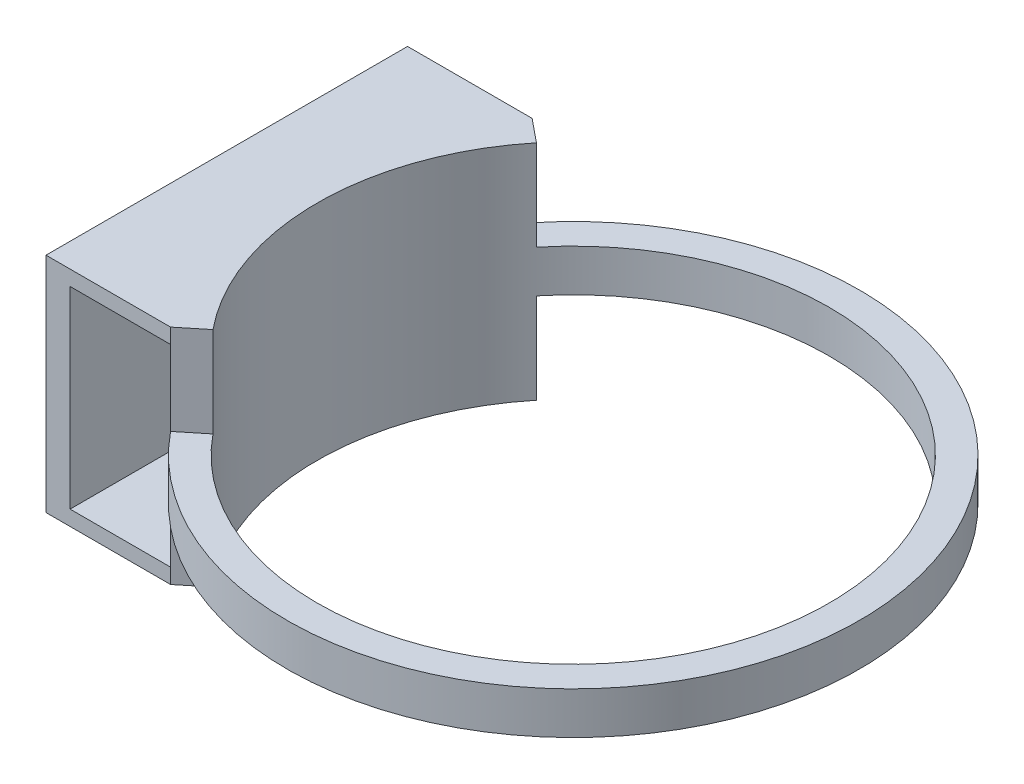
ISO-10303-21;
HEADER;
FILE_DESCRIPTION(('STEP AP214'),'2;1');
FILE_NAME('part.step','',(''),(''),'','','');
FILE_SCHEMA(('AUTOMOTIVE_DESIGN { 1 0 10303 214 1 1 1 1 }'));
ENDSEC;
DATA;
#1=APPLICATION_CONTEXT('core data for automotive mechanical design processes');
#2=APPLICATION_PROTOCOL_DEFINITION('international standard','automotive_design',2000,#1);
#3=PRODUCT_CONTEXT('',#1,'mechanical');
#4=PRODUCT('Part','Part','',(#3));
#5=PRODUCT_RELATED_PRODUCT_CATEGORY('part','',(#4));
#6=PRODUCT_DEFINITION_FORMATION('','',#4);
#7=PRODUCT_DEFINITION_CONTEXT('part definition',#1,'design');
#8=PRODUCT_DEFINITION('design','',#6,#7);
#9=PRODUCT_DEFINITION_SHAPE('','',#8);
#10=(LENGTH_UNIT() NAMED_UNIT(*) SI_UNIT(.MILLI.,.METRE.));
#11=(NAMED_UNIT(*) PLANE_ANGLE_UNIT() SI_UNIT($,.RADIAN.));
#12=(NAMED_UNIT(*) SI_UNIT($,.STERADIAN.) SOLID_ANGLE_UNIT());
#13=UNCERTAINTY_MEASURE_WITH_UNIT(LENGTH_MEASURE(1.E-05),#10,'distance_accuracy_value','');
#14=(GEOMETRIC_REPRESENTATION_CONTEXT(3) GLOBAL_UNCERTAINTY_ASSIGNED_CONTEXT((#13)) GLOBAL_UNIT_ASSIGNED_CONTEXT((#10,
#11,#12)) REPRESENTATION_CONTEXT('',''));
#15=CARTESIAN_POINT('',(0.,0.,0.));
#16=DIRECTION('',(0.,0.,1.));
#17=DIRECTION('',(1.,0.,0.));
#18=AXIS2_PLACEMENT_3D('',#15,#16,#17);
#19=CARTESIAN_POINT('',(0.,0.5,0.));
#20=DIRECTION('',(0.,1.,0.));
#21=DIRECTION('',(0.,0.,1.));
#22=AXIS2_PLACEMENT_3D('',#19,#20,#21);
#23=PLANE('',#22);
#24=DIRECTION('',(1.,0.,0.));
#25=VECTOR('',#24,1.);
#26=CARTESIAN_POINT('',(-11.5,0.5,6.));
#27=LINE('',#26,#25);
#28=CARTESIAN_POINT('',(-10.7,0.5,6.));
#29=VERTEX_POINT('',#28);
#30=CARTESIAN_POINT('',(-7.36545993132812,0.5,6.));
#31=VERTEX_POINT('',#30);
#32=EDGE_CURVE('E268',#29,#31,#27,.T.);
#33=ORIENTED_EDGE('',*,*,#32,.T.);
#34=CARTESIAN_POINT('',(0.,0.5,0.));
#35=DIRECTION('',(0.,1.,0.));
#36=DIRECTION('',(0.,0.,1.));
#37=AXIS2_PLACEMENT_3D('',#34,#35,#36);
#38=CIRCLE('',#37,9.5);
#39=CARTESIAN_POINT('',(-7.36545993132812,0.5,-6.));
#40=VERTEX_POINT('',#39);
#41=EDGE_CURVE('E163',#40,#31,#38,.T.);
#42=ORIENTED_EDGE('',*,*,#41,.F.);
#43=DIRECTION('',(-1.,0.,0.));
#44=VECTOR('',#43,1.);
#45=CARTESIAN_POINT('',(-11.5,0.5,-6.));
#46=LINE('',#45,#44);
#47=CARTESIAN_POINT('',(-10.7,0.5,-6.));
#48=VERTEX_POINT('',#47);
#49=EDGE_CURVE('E265',#40,#48,#46,.T.);
#50=ORIENTED_EDGE('',*,*,#49,.T.);
#51=DIRECTION('',(0.,0.,-1.));
#52=VECTOR('',#51,1.);
#53=CARTESIAN_POINT('',(-10.7,0.5,-6.));
#54=LINE('',#53,#52);
#55=EDGE_CURVE('E63',#29,#48,#54,.T.);
#56=ORIENTED_EDGE('',*,*,#55,.F.);
#57=EDGE_LOOP('',(#33,#42,#50,#56));
#58=FACE_BOUND('',#57,.T.);
#59=ADVANCED_FACE('F39',(#58),#23,.T.);
#60=CARTESIAN_POINT('',(0.,0.,0.));
#61=DIRECTION('',(0.,1.,0.));
#62=DIRECTION('',(0.,0.,1.));
#63=AXIS2_PLACEMENT_3D('',#60,#61,#62);
#64=PLANE('',#63);
#65=DIRECTION('',(-1.,0.,0.));
#66=VECTOR('',#65,1.);
#67=CARTESIAN_POINT('',(-11.5,0.,-6.));
#68=LINE('',#67,#66);
#69=CARTESIAN_POINT('',(-7.36545993132812,0.,-6.));
#70=VERTEX_POINT('',#69);
#71=CARTESIAN_POINT('',(-11.5,0.,-6.));
#72=VERTEX_POINT('',#71);
#73=EDGE_CURVE('E264',#70,#72,#68,.T.);
#74=ORIENTED_EDGE('',*,*,#73,.F.);
#75=DIRECTION('',(-0.775311571718749,0.,-0.631578947368421));
#76=VECTOR('',#75,1.);
#77=CARTESIAN_POINT('',(-7.36545993132812,0.,-6.));
#78=LINE('',#77,#76);
#79=CARTESIAN_POINT('',(-6.59014835960937,0.,-5.36842105263158));
#80=VERTEX_POINT('',#79);
#81=EDGE_CURVE('E158',#80,#70,#78,.T.);
#82=ORIENTED_EDGE('',*,*,#81,.F.);
#83=CARTESIAN_POINT('',(0.,0.,0.));
#84=DIRECTION('',(0.,1.,0.));
#85=DIRECTION('',(0.,0.,1.));
#86=AXIS2_PLACEMENT_3D('',#83,#84,#85);
#87=CIRCLE('',#86,8.5);
#88=CARTESIAN_POINT('',(-6.59014835960937,0.,5.36842105263158));
#89=VERTEX_POINT('',#88);
#90=EDGE_CURVE('E260',#80,#89,#87,.T.);
#91=ORIENTED_EDGE('',*,*,#90,.T.);
#92=DIRECTION('',(0.775311571718749,0.,-0.631578947368422));
#93=VECTOR('',#92,1.);
#94=CARTESIAN_POINT('',(-7.36545993132812,0.,6.));
#95=LINE('',#94,#93);
#96=CARTESIAN_POINT('',(-7.36545993132812,0.,6.));
#97=VERTEX_POINT('',#96);
#98=EDGE_CURVE('E300',#97,#89,#95,.T.);
#99=ORIENTED_EDGE('',*,*,#98,.F.);
#100=DIRECTION('',(1.,0.,0.));
#101=VECTOR('',#100,1.);
#102=CARTESIAN_POINT('',(-11.5,0.,6.));
#103=LINE('',#102,#101);
#104=CARTESIAN_POINT('',(-11.5,0.,6.));
#105=VERTEX_POINT('',#104);
#106=EDGE_CURVE('E269',#105,#97,#103,.T.);
#107=ORIENTED_EDGE('',*,*,#106,.F.);
#108=DIRECTION('',(0.,0.,1.));
#109=VECTOR('',#108,1.);
#110=CARTESIAN_POINT('',(-11.5,0.,-6.));
#111=LINE('',#110,#109);
#112=EDGE_CURVE('E275',#72,#105,#111,.T.);
#113=ORIENTED_EDGE('',*,*,#112,.F.);
#114=EDGE_LOOP('',(#74,#82,#91,#99,#107,#113));
#115=FACE_BOUND('',#114,.T.);
#116=ADVANCED_FACE('F297',(#115),#64,.F.);
#117=CARTESIAN_POINT('',(0.,0.5,0.));
#118=DIRECTION('',(0.,-1.,0.));
#119=DIRECTION('',(0.,0.,-1.));
#120=AXIS2_PLACEMENT_3D('',#117,#118,#119);
#121=CYLINDRICAL_SURFACE('',#120,9.5);
#122=CARTESIAN_POINT('',(0.,3.,0.));
#123=DIRECTION('',(0.,-1.,0.));
#124=DIRECTION('',(0.,0.,-1.));
#125=AXIS2_PLACEMENT_3D('',#122,#123,#124);
#126=CIRCLE('',#125,9.5);
#127=CARTESIAN_POINT('',(-7.36545993132812,3.,-6.));
#128=VERTEX_POINT('',#127);
#129=CARTESIAN_POINT('',(-7.36545993132812,3.,6.));
#130=VERTEX_POINT('',#129);
#131=EDGE_CURVE('E148',#128,#130,#126,.T.);
#132=ORIENTED_EDGE('',*,*,#131,.F.);
#133=DIRECTION('',(0.,-1.,0.));
#134=VECTOR('',#133,1.);
#135=CARTESIAN_POINT('',(-7.36545993132812,3.,-6.));
#136=LINE('',#135,#134);
#137=EDGE_CURVE('E193',#128,#40,#136,.T.);
#138=ORIENTED_EDGE('',*,*,#137,.T.);
#139=ORIENTED_EDGE('',*,*,#41,.T.);
#140=DIRECTION('',(0.,-1.,0.));
#141=VECTOR('',#140,1.);
#142=CARTESIAN_POINT('',(-7.36545993132812,3.,6.));
#143=LINE('',#142,#141);
#144=EDGE_CURVE('E142',#130,#31,#143,.T.);
#145=ORIENTED_EDGE('',*,*,#144,.F.);
#146=EDGE_LOOP('',(#132,#138,#139,#145));
#147=FACE_BOUND('',#146,.T.);
#148=CARTESIAN_POINT('',(0.,4.4,0.));
#149=DIRECTION('',(0.,1.,0.));
#150=DIRECTION('',(0.,0.,1.));
#151=AXIS2_PLACEMENT_3D('',#148,#149,#150);
#152=CIRCLE('',#151,9.5);
#153=CARTESIAN_POINT('',(-7.36545993132812,4.4,6.));
#154=VERTEX_POINT('',#153);
#155=CARTESIAN_POINT('',(-7.36545993132812,4.4,-6.));
#156=VERTEX_POINT('',#155);
#157=EDGE_CURVE('E173',#154,#156,#152,.T.);
#158=ORIENTED_EDGE('',*,*,#157,.F.);
#159=DIRECTION('',(0.,1.,0.));
#160=VECTOR('',#159,1.);
#161=CARTESIAN_POINT('',(-7.36545993132812,4.4,6.));
#162=LINE('',#161,#160);
#163=CARTESIAN_POINT('',(-7.36545993132812,6.9,6.));
#164=VERTEX_POINT('',#163);
#165=EDGE_CURVE('E196',#154,#164,#162,.T.);
#166=ORIENTED_EDGE('',*,*,#165,.T.);
#167=CARTESIAN_POINT('',(0.,6.9,0.));
#168=DIRECTION('',(0.,1.,0.));
#169=DIRECTION('',(0.,0.,1.));
#170=AXIS2_PLACEMENT_3D('',#167,#168,#169);
#171=CIRCLE('',#170,9.5);
#172=CARTESIAN_POINT('',(-7.36545993132812,6.9,-6.));
#173=VERTEX_POINT('',#172);
#174=EDGE_CURVE('E240',#173,#164,#171,.T.);
#175=ORIENTED_EDGE('',*,*,#174,.F.);
#176=DIRECTION('',(0.,1.,0.));
#177=VECTOR('',#176,1.);
#178=CARTESIAN_POINT('',(-7.36545993132812,4.4,-6.));
#179=LINE('',#178,#177);
#180=EDGE_CURVE('E189',#156,#173,#179,.T.);
#181=ORIENTED_EDGE('',*,*,#180,.F.);
#182=EDGE_LOOP('',(#158,#166,#175,#181));
#183=FACE_BOUND('',#182,.T.);
#184=ADVANCED_FACE('F41',(#147,#183),#121,.T.);
#185=CARTESIAN_POINT('',(-11.5,0.5,-6.));
#186=DIRECTION('',(0.,0.,1.));
#187=DIRECTION('',(1.,0.,0.));
#188=AXIS2_PLACEMENT_3D('',#185,#186,#187);
#189=PLANE('',#188);
#190=ORIENTED_EDGE('',*,*,#73,.T.);
#191=DIRECTION('',(0.,-1.,0.));
#192=VECTOR('',#191,1.);
#193=CARTESIAN_POINT('',(-11.5,0.5,-6.));
#194=LINE('',#193,#192);
#195=CARTESIAN_POINT('',(-11.5,7.4,-6.));
#196=VERTEX_POINT('',#195);
#197=EDGE_CURVE('E48',#196,#72,#194,.T.);
#198=ORIENTED_EDGE('',*,*,#197,.F.);
#199=DIRECTION('',(-1.,0.,0.));
#200=VECTOR('',#199,1.);
#201=CARTESIAN_POINT('',(-11.5,7.4,-6.));
#202=LINE('',#201,#200);
#203=CARTESIAN_POINT('',(-7.36545993132812,7.4,-6.));
#204=VERTEX_POINT('',#203);
#205=EDGE_CURVE('E214',#204,#196,#202,.T.);
#206=ORIENTED_EDGE('',*,*,#205,.F.);
#207=DIRECTION('',(0.,-1.,0.));
#208=VECTOR('',#207,1.);
#209=CARTESIAN_POINT('',(-7.36545993132812,7.4,-6.));
#210=LINE('',#209,#208);
#211=EDGE_CURVE('E227',#204,#173,#210,.T.);
#212=ORIENTED_EDGE('',*,*,#211,.T.);
#213=DIRECTION('',(-1.,0.,0.));
#214=VECTOR('',#213,1.);
#215=CARTESIAN_POINT('',(-11.5,6.9,-6.));
#216=LINE('',#215,#214);
#217=CARTESIAN_POINT('',(-10.7,6.9,-6.));
#218=VERTEX_POINT('',#217);
#219=EDGE_CURVE('E213',#173,#218,#216,.T.);
#220=ORIENTED_EDGE('',*,*,#219,.T.);
#221=DIRECTION('',(0.,-1.,0.));
#222=VECTOR('',#221,1.);
#223=CARTESIAN_POINT('',(-10.7,6.9,-6.));
#224=LINE('',#223,#222);
#225=EDGE_CURVE('E250',#218,#48,#224,.T.);
#226=ORIENTED_EDGE('',*,*,#225,.T.);
#227=ORIENTED_EDGE('',*,*,#49,.F.);
#228=DIRECTION('',(0.,-1.,0.));
#229=VECTOR('',#228,1.);
#230=CARTESIAN_POINT('',(-7.36545993132812,0.5,-6.));
#231=LINE('',#230,#229);
#232=EDGE_CURVE('E11',#40,#70,#231,.T.);
#233=ORIENTED_EDGE('',*,*,#232,.T.);
#234=EDGE_LOOP('',(#190,#198,#206,#212,#220,#226,#227,#233));
#235=FACE_BOUND('',#234,.T.);
#236=ADVANCED_FACE('F311',(#235),#189,.F.);
#237=CARTESIAN_POINT('',(-11.5,0.5,-6.));
#238=DIRECTION('',(1.,0.,0.));
#239=DIRECTION('',(0.,0.,-1.));
#240=AXIS2_PLACEMENT_3D('',#237,#238,#239);
#241=PLANE('',#240);
#242=ORIENTED_EDGE('',*,*,#112,.T.);
#243=DIRECTION('',(0.,-1.,0.));
#244=VECTOR('',#243,1.);
#245=CARTESIAN_POINT('',(-11.5,0.5,6.));
#246=LINE('',#245,#244);
#247=CARTESIAN_POINT('',(-11.5,7.4,6.));
#248=VERTEX_POINT('',#247);
#249=EDGE_CURVE('E283',#248,#105,#246,.T.);
#250=ORIENTED_EDGE('',*,*,#249,.F.);
#251=DIRECTION('',(0.,0.,1.));
#252=VECTOR('',#251,1.);
#253=CARTESIAN_POINT('',(-11.5,7.4,-6.));
#254=LINE('',#253,#252);
#255=EDGE_CURVE('E218',#196,#248,#254,.T.);
#256=ORIENTED_EDGE('',*,*,#255,.F.);
#257=ORIENTED_EDGE('',*,*,#197,.T.);
#258=EDGE_LOOP('',(#242,#250,#256,#257));
#259=FACE_BOUND('',#258,.T.);
#260=ADVANCED_FACE('F291',(#259),#241,.F.);
#261=CARTESIAN_POINT('',(-11.5,0.5,6.));
#262=DIRECTION('',(0.,0.,-1.));
#263=DIRECTION('',(-1.,0.,0.));
#264=AXIS2_PLACEMENT_3D('',#261,#262,#263);
#265=PLANE('',#264);
#266=ORIENTED_EDGE('',*,*,#106,.T.);
#267=DIRECTION('',(0.,-1.,0.));
#268=VECTOR('',#267,1.);
#269=CARTESIAN_POINT('',(-7.36545993132812,0.5,6.));
#270=LINE('',#269,#268);
#271=EDGE_CURVE('E272',#31,#97,#270,.T.);
#272=ORIENTED_EDGE('',*,*,#271,.F.);
#273=ORIENTED_EDGE('',*,*,#32,.F.);
#274=DIRECTION('',(0.,-1.,0.));
#275=VECTOR('',#274,1.);
#276=CARTESIAN_POINT('',(-10.7,6.9,6.));
#277=LINE('',#276,#275);
#278=CARTESIAN_POINT('',(-10.7,6.9,6.));
#279=VERTEX_POINT('',#278);
#280=EDGE_CURVE('E256',#279,#29,#277,.T.);
#281=ORIENTED_EDGE('',*,*,#280,.F.);
#282=DIRECTION('',(1.,0.,0.));
#283=VECTOR('',#282,1.);
#284=CARTESIAN_POINT('',(-11.5,6.9,6.));
#285=LINE('',#284,#283);
#286=EDGE_CURVE('E219',#279,#164,#285,.T.);
#287=ORIENTED_EDGE('',*,*,#286,.T.);
#288=DIRECTION('',(0.,-1.,0.));
#289=VECTOR('',#288,1.);
#290=CARTESIAN_POINT('',(-7.36545993132812,7.4,6.));
#291=LINE('',#290,#289);
#292=CARTESIAN_POINT('',(-7.36545993132812,7.4,6.));
#293=VERTEX_POINT('',#292);
#294=EDGE_CURVE('E237',#293,#164,#291,.T.);
#295=ORIENTED_EDGE('',*,*,#294,.F.);
#296=DIRECTION('',(1.,0.,0.));
#297=VECTOR('',#296,1.);
#298=CARTESIAN_POINT('',(-11.5,7.4,6.));
#299=LINE('',#298,#297);
#300=EDGE_CURVE('E223',#248,#293,#299,.T.);
#301=ORIENTED_EDGE('',*,*,#300,.F.);
#302=ORIENTED_EDGE('',*,*,#249,.T.);
#303=EDGE_LOOP('',(#266,#272,#273,#281,#287,#295,#301,#302));
#304=FACE_BOUND('',#303,.T.);
#305=ADVANCED_FACE('F303',(#304),#265,.F.);
#306=CARTESIAN_POINT('',(0.,0.5,0.));
#307=DIRECTION('',(0.,-1.,0.));
#308=DIRECTION('',(0.,0.,-1.));
#309=AXIS2_PLACEMENT_3D('',#306,#307,#308);
#310=CYLINDRICAL_SURFACE('',#309,8.5);
#311=DIRECTION('',(0.,-1.,0.));
#312=VECTOR('',#311,1.);
#313=CARTESIAN_POINT('',(-6.59014835960937,3.,-5.36842105263158));
#314=LINE('',#313,#312);
#315=CARTESIAN_POINT('',(-6.59014835960937,3.,-5.36842105263158));
#316=VERTEX_POINT('',#315);
#317=EDGE_CURVE('E168',#316,#80,#314,.T.);
#318=ORIENTED_EDGE('',*,*,#317,.F.);
#319=CARTESIAN_POINT('',(0.,3.,0.));
#320=DIRECTION('',(0.,1.,0.));
#321=DIRECTION('',(0.,0.,-1.));
#322=AXIS2_PLACEMENT_3D('',#319,#320,#321);
#323=CIRCLE('',#322,8.5);
#324=CARTESIAN_POINT('',(-6.59014835960937,3.,5.36842105263158));
#325=VERTEX_POINT('',#324);
#326=EDGE_CURVE('E147',#325,#316,#323,.T.);
#327=ORIENTED_EDGE('',*,*,#326,.F.);
#328=DIRECTION('',(0.,-1.,0.));
#329=VECTOR('',#328,1.);
#330=CARTESIAN_POINT('',(-6.59014835960937,3.,5.36842105263158));
#331=LINE('',#330,#329);
#332=EDGE_CURVE('E144',#325,#89,#331,.T.);
#333=ORIENTED_EDGE('',*,*,#332,.T.);
#334=ORIENTED_EDGE('',*,*,#90,.F.);
#335=EDGE_LOOP('',(#318,#327,#333,#334));
#336=FACE_BOUND('',#335,.T.);
#337=DIRECTION('',(0.,1.,0.));
#338=VECTOR('',#337,1.);
#339=CARTESIAN_POINT('',(-6.59014835960937,4.4,5.36842105263158));
#340=LINE('',#339,#338);
#341=CARTESIAN_POINT('',(-6.59014835960937,4.4,5.36842105263158));
#342=VERTEX_POINT('',#341);
#343=CARTESIAN_POINT('',(-6.59014835960937,7.4,5.36842105263158));
#344=VERTEX_POINT('',#343);
#345=EDGE_CURVE('E201',#342,#344,#340,.T.);
#346=ORIENTED_EDGE('',*,*,#345,.F.);
#347=CARTESIAN_POINT('',(0.,4.4,0.));
#348=DIRECTION('',(0.,-1.,0.));
#349=DIRECTION('',(0.,0.,1.));
#350=AXIS2_PLACEMENT_3D('',#347,#348,#349);
#351=CIRCLE('',#350,8.5);
#352=CARTESIAN_POINT('',(-6.59014835960937,4.4,-5.36842105263158));
#353=VERTEX_POINT('',#352);
#354=EDGE_CURVE('E182',#353,#342,#351,.T.);
#355=ORIENTED_EDGE('',*,*,#354,.F.);
#356=DIRECTION('',(0.,1.,0.));
#357=VECTOR('',#356,1.);
#358=CARTESIAN_POINT('',(-6.59014835960937,4.4,-5.36842105263158));
#359=LINE('',#358,#357);
#360=CARTESIAN_POINT('',(-6.59014835960937,7.4,-5.36842105263158));
#361=VERTEX_POINT('',#360);
#362=EDGE_CURVE('E204',#353,#361,#359,.T.);
#363=ORIENTED_EDGE('',*,*,#362,.T.);
#364=CARTESIAN_POINT('',(0.,7.4,0.));
#365=DIRECTION('',(0.,1.,0.));
#366=DIRECTION('',(0.,0.,1.));
#367=AXIS2_PLACEMENT_3D('',#364,#365,#366);
#368=CIRCLE('',#367,8.5);
#369=EDGE_CURVE('E200',#361,#344,#368,.T.);
#370=ORIENTED_EDGE('',*,*,#369,.T.);
#371=EDGE_LOOP('',(#346,#355,#363,#370));
#372=FACE_BOUND('',#371,.T.);
#373=ADVANCED_FACE('F332',(#336,#372),#310,.F.);
#374=CARTESIAN_POINT('',(-10.7,6.9,-6.));
#375=DIRECTION('',(-1.,0.,0.));
#376=DIRECTION('',(0.,0.,1.));
#377=AXIS2_PLACEMENT_3D('',#374,#375,#376);
#378=PLANE('',#377);
#379=ORIENTED_EDGE('',*,*,#55,.T.);
#380=ORIENTED_EDGE('',*,*,#225,.F.);
#381=DIRECTION('',(0.,0.,-1.));
#382=VECTOR('',#381,1.);
#383=CARTESIAN_POINT('',(-10.7,6.9,-6.));
#384=LINE('',#383,#382);
#385=EDGE_CURVE('E246',#279,#218,#384,.T.);
#386=ORIENTED_EDGE('',*,*,#385,.F.);
#387=ORIENTED_EDGE('',*,*,#280,.T.);
#388=EDGE_LOOP('',(#379,#380,#386,#387));
#389=FACE_BOUND('',#388,.T.);
#390=ADVANCED_FACE('F320',(#389),#378,.F.);
#391=CARTESIAN_POINT('',(0.,6.9,0.));
#392=DIRECTION('',(0.,1.,0.));
#393=DIRECTION('',(0.,0.,1.));
#394=AXIS2_PLACEMENT_3D('',#391,#392,#393);
#395=PLANE('',#394);
#396=ORIENTED_EDGE('',*,*,#286,.F.);
#397=ORIENTED_EDGE('',*,*,#385,.T.);
#398=ORIENTED_EDGE('',*,*,#219,.F.);
#399=ORIENTED_EDGE('',*,*,#174,.T.);
#400=EDGE_LOOP('',(#396,#397,#398,#399));
#401=FACE_BOUND('',#400,.T.);
#402=ADVANCED_FACE('F316',(#401),#395,.F.);
#403=CARTESIAN_POINT('',(0.,7.4,0.));
#404=DIRECTION('',(0.,1.,0.));
#405=DIRECTION('',(0.,0.,1.));
#406=AXIS2_PLACEMENT_3D('',#403,#404,#405);
#407=PLANE('',#406);
#408=DIRECTION('',(-0.775311571718749,0.,0.631578947368421));
#409=VECTOR('',#408,1.);
#410=CARTESIAN_POINT('',(-7.36545993132812,7.4,6.));
#411=LINE('',#410,#409);
#412=EDGE_CURVE('E178',#344,#293,#411,.T.);
#413=ORIENTED_EDGE('',*,*,#412,.F.);
#414=ORIENTED_EDGE('',*,*,#369,.F.);
#415=DIRECTION('',(0.77531157171875,0.,0.631578947368421));
#416=VECTOR('',#415,1.);
#417=CARTESIAN_POINT('',(-7.36545993132812,7.4,-6.));
#418=LINE('',#417,#416);
#419=EDGE_CURVE('E190',#204,#361,#418,.T.);
#420=ORIENTED_EDGE('',*,*,#419,.F.);
#421=ORIENTED_EDGE('',*,*,#205,.T.);
#422=ORIENTED_EDGE('',*,*,#255,.T.);
#423=ORIENTED_EDGE('',*,*,#300,.T.);
#424=EDGE_LOOP('',(#413,#414,#420,#421,#422,#423));
#425=FACE_BOUND('',#424,.T.);
#426=ADVANCED_FACE('F308',(#425),#407,.T.);
#427=CARTESIAN_POINT('',(-7.36545993132812,4.4,6.));
#428=DIRECTION('',(-0.631578947368421,0.,-0.775311571718749));
#429=DIRECTION('',(-0.775311571718749,0.,0.631578947368421));
#430=AXIS2_PLACEMENT_3D('',#427,#428,#429);
#431=PLANE('',#430);
#432=ORIENTED_EDGE('',*,*,#412,.T.);
#433=ORIENTED_EDGE('',*,*,#294,.T.);
#434=ORIENTED_EDGE('',*,*,#165,.F.);
#435=DIRECTION('',(-0.775311571718749,0.,0.631578947368421));
#436=VECTOR('',#435,1.);
#437=CARTESIAN_POINT('',(-7.36545993132812,4.4,6.));
#438=LINE('',#437,#436);
#439=EDGE_CURVE('E185',#342,#154,#438,.T.);
#440=ORIENTED_EDGE('',*,*,#439,.F.);
#441=ORIENTED_EDGE('',*,*,#345,.T.);
#442=EDGE_LOOP('',(#432,#433,#434,#440,#441));
#443=FACE_BOUND('',#442,.T.);
#444=ADVANCED_FACE('F323',(#443),#431,.F.);
#445=CARTESIAN_POINT('',(-7.36545993132812,4.4,-6.));
#446=DIRECTION('',(-0.631578947368421,0.,0.775311571718749));
#447=DIRECTION('',(0.77531157171875,0.,0.631578947368421));
#448=AXIS2_PLACEMENT_3D('',#445,#446,#447);
#449=PLANE('',#448);
#450=ORIENTED_EDGE('',*,*,#419,.T.);
#451=ORIENTED_EDGE('',*,*,#362,.F.);
#452=DIRECTION('',(0.77531157171875,0.,0.631578947368421));
#453=VECTOR('',#452,1.);
#454=CARTESIAN_POINT('',(-7.36545993132812,4.4,-6.));
#455=LINE('',#454,#453);
#456=EDGE_CURVE('E177',#156,#353,#455,.T.);
#457=ORIENTED_EDGE('',*,*,#456,.F.);
#458=ORIENTED_EDGE('',*,*,#180,.T.);
#459=ORIENTED_EDGE('',*,*,#211,.F.);
#460=EDGE_LOOP('',(#450,#451,#457,#458,#459));
#461=FACE_BOUND('',#460,.T.);
#462=ADVANCED_FACE('F333',(#461),#449,.F.);
#463=CARTESIAN_POINT('',(0.,4.4,0.));
#464=DIRECTION('',(0.,1.,0.));
#465=DIRECTION('',(0.,0.,1.));
#466=AXIS2_PLACEMENT_3D('',#463,#464,#465);
#467=PLANE('',#466);
#468=ORIENTED_EDGE('',*,*,#157,.T.);
#469=ORIENTED_EDGE('',*,*,#456,.T.);
#470=ORIENTED_EDGE('',*,*,#354,.T.);
#471=ORIENTED_EDGE('',*,*,#439,.T.);
#472=EDGE_LOOP('',(#468,#469,#470,#471));
#473=FACE_BOUND('',#472,.T.);
#474=ADVANCED_FACE('F328',(#473),#467,.T.);
#475=CARTESIAN_POINT('',(-7.36545993132812,3.,-6.));
#476=DIRECTION('',(-0.631578947368421,0.,0.775311571718749));
#477=DIRECTION('',(0.775311571718749,0.,0.631578947368421));
#478=AXIS2_PLACEMENT_3D('',#475,#476,#477);
#479=PLANE('',#478);
#480=ORIENTED_EDGE('',*,*,#81,.T.);
#481=ORIENTED_EDGE('',*,*,#232,.F.);
#482=ORIENTED_EDGE('',*,*,#137,.F.);
#483=DIRECTION('',(-0.775311571718749,0.,-0.631578947368421));
#484=VECTOR('',#483,1.);
#485=CARTESIAN_POINT('',(-7.36545993132812,3.,-6.));
#486=LINE('',#485,#484);
#487=EDGE_CURVE('E154',#316,#128,#486,.T.);
#488=ORIENTED_EDGE('',*,*,#487,.F.);
#489=ORIENTED_EDGE('',*,*,#317,.T.);
#490=EDGE_LOOP('',(#480,#481,#482,#488,#489));
#491=FACE_BOUND('',#490,.T.);
#492=ADVANCED_FACE('F340',(#491),#479,.F.);
#493=CARTESIAN_POINT('',(-7.36545993132812,3.,6.));
#494=DIRECTION('',(-0.631578947368422,0.,-0.775311571718749));
#495=DIRECTION('',(-0.775311571718749,0.,0.631578947368422));
#496=AXIS2_PLACEMENT_3D('',#493,#494,#495);
#497=PLANE('',#496);
#498=ORIENTED_EDGE('',*,*,#98,.T.);
#499=ORIENTED_EDGE('',*,*,#332,.F.);
#500=DIRECTION('',(0.775311571718749,0.,-0.631578947368422));
#501=VECTOR('',#500,1.);
#502=CARTESIAN_POINT('',(-7.36545993132812,3.,6.));
#503=LINE('',#502,#501);
#504=EDGE_CURVE('E55',#130,#325,#503,.T.);
#505=ORIENTED_EDGE('',*,*,#504,.F.);
#506=ORIENTED_EDGE('',*,*,#144,.T.);
#507=ORIENTED_EDGE('',*,*,#271,.T.);
#508=EDGE_LOOP('',(#498,#499,#505,#506,#507));
#509=FACE_BOUND('',#508,.T.);
#510=ADVANCED_FACE('F140',(#509),#497,.F.);
#511=CARTESIAN_POINT('',(0.,3.,0.));
#512=DIRECTION('',(0.,-1.,0.));
#513=DIRECTION('',(0.,0.,-1.));
#514=AXIS2_PLACEMENT_3D('',#511,#512,#513);
#515=PLANE('',#514);
#516=ORIENTED_EDGE('',*,*,#131,.T.);
#517=ORIENTED_EDGE('',*,*,#504,.T.);
#518=ORIENTED_EDGE('',*,*,#326,.T.);
#519=ORIENTED_EDGE('',*,*,#487,.T.);
#520=EDGE_LOOP('',(#516,#517,#518,#519));
#521=FACE_BOUND('',#520,.T.);
#522=ADVANCED_FACE('F152',(#521),#515,.T.);
#523=CLOSED_SHELL('',(#59,#116,#184,#236,#260,#305,#373,#390,#402,#426,#444,#462,#474,#492,#510,#522));
#524=MANIFOLD_SOLID_BREP('B2',#523);
#525=ADVANCED_BREP_SHAPE_REPRESENTATION('',(#18,#524),#14);
#526=SHAPE_DEFINITION_REPRESENTATION(#9,#525);
ENDSEC;
END-ISO-10303-21;
